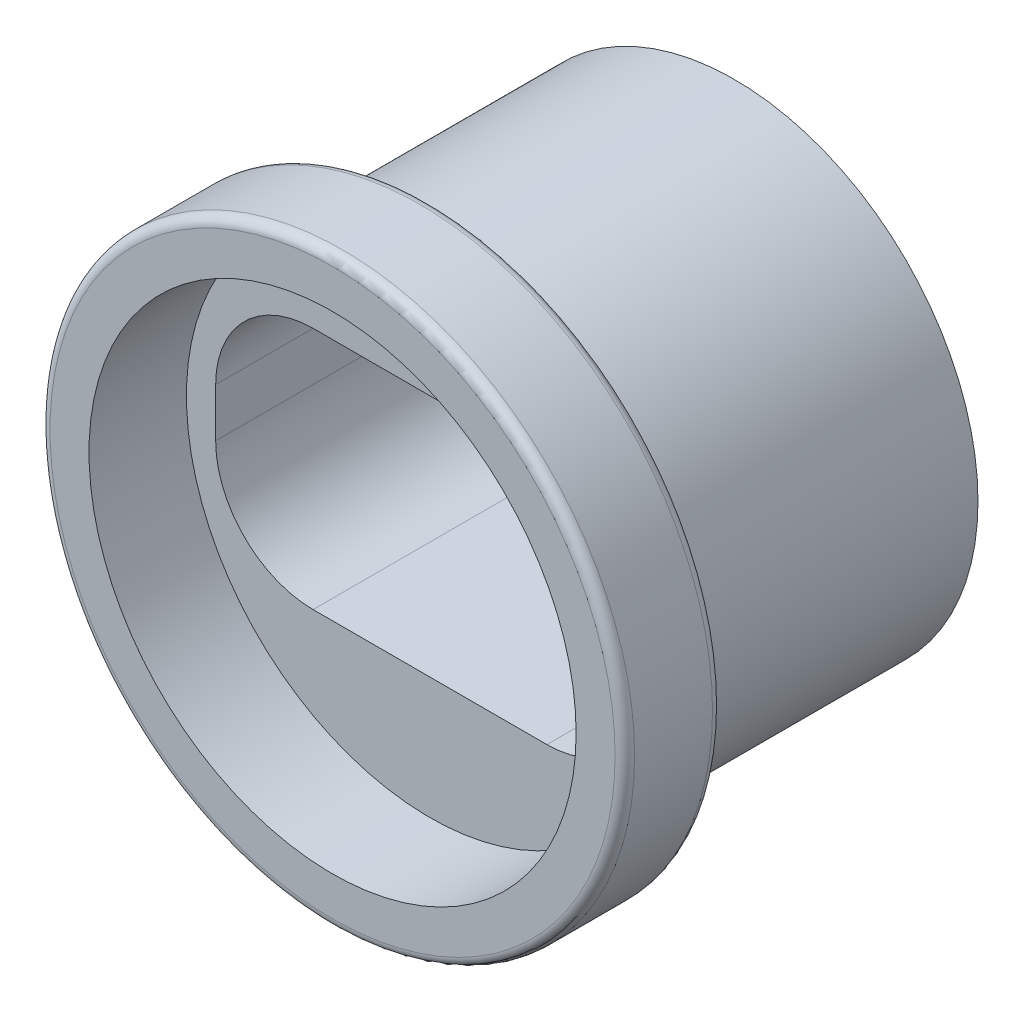
ISO-10303-21;
HEADER;
FILE_DESCRIPTION(('STEP AP214'),'2;1');
FILE_NAME('part.step','',(''),(''),'','','');
FILE_SCHEMA(('AUTOMOTIVE_DESIGN { 1 0 10303 214 1 1 1 1 }'));
ENDSEC;
DATA;
#1=APPLICATION_CONTEXT('core data for automotive mechanical design processes');
#2=APPLICATION_PROTOCOL_DEFINITION('international standard','automotive_design',2000,#1);
#3=PRODUCT_CONTEXT('',#1,'mechanical');
#4=PRODUCT('Part','Part','',(#3));
#5=PRODUCT_RELATED_PRODUCT_CATEGORY('part','',(#4));
#6=PRODUCT_DEFINITION_FORMATION('','',#4);
#7=PRODUCT_DEFINITION_CONTEXT('part definition',#1,'design');
#8=PRODUCT_DEFINITION('design','',#6,#7);
#9=PRODUCT_DEFINITION_SHAPE('','',#8);
#10=(LENGTH_UNIT() NAMED_UNIT(*) SI_UNIT(.MILLI.,.METRE.));
#11=(NAMED_UNIT(*) PLANE_ANGLE_UNIT() SI_UNIT($,.RADIAN.));
#12=(NAMED_UNIT(*) SI_UNIT($,.STERADIAN.) SOLID_ANGLE_UNIT());
#13=UNCERTAINTY_MEASURE_WITH_UNIT(LENGTH_MEASURE(1.E-05),#10,'distance_accuracy_value','');
#14=(GEOMETRIC_REPRESENTATION_CONTEXT(3) GLOBAL_UNCERTAINTY_ASSIGNED_CONTEXT((#13)) GLOBAL_UNIT_ASSIGNED_CONTEXT((#10,
#11,#12)) REPRESENTATION_CONTEXT('',''));
#15=CARTESIAN_POINT('',(0.,0.,0.));
#16=DIRECTION('',(0.,0.,1.));
#17=DIRECTION('',(1.,0.,0.));
#18=AXIS2_PLACEMENT_3D('',#15,#16,#17);
#19=CARTESIAN_POINT('',(0.,0.,10.4775));
#20=DIRECTION('',(0.,0.,1.));
#21=DIRECTION('',(1.,0.,0.));
#22=AXIS2_PLACEMENT_3D('',#19,#20,#21);
#23=PLANE('',#22);
#24=CARTESIAN_POINT('',(0.,0.,10.4775));
#25=DIRECTION('',(0.,0.,1.));
#26=DIRECTION('',(1.,0.,0.));
#27=AXIS2_PLACEMENT_3D('',#24,#25,#26);
#28=CIRCLE('',#27,7.366);
#29=CARTESIAN_POINT('',(7.366,0.,10.4775));
#30=VERTEX_POINT('',#29);
#31=EDGE_CURVE('E62',#30,#30,#28,.T.);
#32=ORIENTED_EDGE('',*,*,#31,.T.);
#33=EDGE_LOOP('',(#32));
#34=FACE_BOUND('',#33,.T.);
#35=CARTESIAN_POINT('',(0.,0.,10.4775));
#36=DIRECTION('',(0.,0.,1.));
#37=DIRECTION('',(1.,0.,0.));
#38=AXIS2_PLACEMENT_3D('',#35,#36,#37);
#39=CIRCLE('',#38,6.35);
#40=CARTESIAN_POINT('',(6.35,0.,10.4775));
#41=VERTEX_POINT('',#40);
#42=EDGE_CURVE('E67',#41,#41,#39,.T.);
#43=ORIENTED_EDGE('',*,*,#42,.F.);
#44=EDGE_LOOP('',(#43));
#45=FACE_BOUND('',#44,.T.);
#46=ADVANCED_FACE('F47',(#34,#45),#23,.T.);
#47=CARTESIAN_POINT('',(0.,0.,7.9375));
#48=DIRECTION('',(0.,0.,1.));
#49=DIRECTION('',(1.,0.,0.));
#50=AXIS2_PLACEMENT_3D('',#47,#48,#49);
#51=PLANE('',#50);
#52=CARTESIAN_POINT('',(0.,0.,7.9375));
#53=DIRECTION('',(0.,0.,1.));
#54=DIRECTION('',(1.,0.,0.));
#55=AXIS2_PLACEMENT_3D('',#52,#53,#54);
#56=CIRCLE('',#55,7.366);
#57=CARTESIAN_POINT('',(7.366,0.,7.9375));
#58=VERTEX_POINT('',#57);
#59=EDGE_CURVE('E11',#58,#58,#56,.F.);
#60=ORIENTED_EDGE('',*,*,#59,.T.);
#61=EDGE_LOOP('',(#60));
#62=FACE_BOUND('',#61,.T.);
#63=CARTESIAN_POINT('',(0.,0.,7.9375));
#64=DIRECTION('',(0.,0.,1.));
#65=DIRECTION('',(1.,0.,0.));
#66=AXIS2_PLACEMENT_3D('',#63,#64,#65);
#67=CIRCLE('',#66,6.35);
#68=CARTESIAN_POINT('',(6.35,0.,7.9375));
#69=VERTEX_POINT('',#68);
#70=EDGE_CURVE('E68',#69,#69,#67,.T.);
#71=ORIENTED_EDGE('',*,*,#70,.T.);
#72=EDGE_LOOP('',(#71));
#73=FACE_BOUND('',#72,.T.);
#74=ADVANCED_FACE('F78',(#62,#73),#51,.F.);
#75=CARTESIAN_POINT('',(0.,0.,10.4775));
#76=DIRECTION('',(0.,0.,-1.));
#77=DIRECTION('',(-1.,0.,0.));
#78=AXIS2_PLACEMENT_3D('',#75,#76,#77);
#79=CYLINDRICAL_SURFACE('',#78,7.62);
#80=CARTESIAN_POINT('',(0.,0.,10.2235));
#81=DIRECTION('',(0.,0.,1.));
#82=DIRECTION('',(1.,0.,0.));
#83=AXIS2_PLACEMENT_3D('',#80,#81,#82);
#84=CIRCLE('',#83,7.62);
#85=CARTESIAN_POINT('',(7.62,0.,10.2235));
#86=VERTEX_POINT('',#85);
#87=EDGE_CURVE('E54',#86,#86,#84,.F.);
#88=ORIENTED_EDGE('',*,*,#87,.T.);
#89=EDGE_LOOP('',(#88));
#90=FACE_BOUND('',#89,.T.);
#91=CARTESIAN_POINT('',(0.,0.,8.1915));
#92=DIRECTION('',(0.,0.,1.));
#93=DIRECTION('',(1.,0.,0.));
#94=AXIS2_PLACEMENT_3D('',#91,#92,#93);
#95=CIRCLE('',#94,7.62);
#96=CARTESIAN_POINT('',(7.62,0.,8.1915));
#97=VERTEX_POINT('',#96);
#98=EDGE_CURVE('E58',#97,#97,#95,.T.);
#99=ORIENTED_EDGE('',*,*,#98,.T.);
#100=EDGE_LOOP('',(#99));
#101=FACE_BOUND('',#100,.T.);
#102=ADVANCED_FACE('F85',(#90,#101),#79,.T.);
#103=CARTESIAN_POINT('',(0.,0.,10.4775));
#104=DIRECTION('',(0.,0.,-1.));
#105=DIRECTION('',(-1.,0.,0.));
#106=AXIS2_PLACEMENT_3D('',#103,#104,#105);
#107=CYLINDRICAL_SURFACE('',#106,6.35);
#108=ORIENTED_EDGE('',*,*,#42,.T.);
#109=EDGE_LOOP('',(#108));
#110=FACE_BOUND('',#109,.T.);
#111=ORIENTED_EDGE('',*,*,#70,.F.);
#112=EDGE_LOOP('',(#111));
#113=FACE_BOUND('',#112,.T.);
#114=ADVANCED_FACE('F74',(#110,#113),#107,.F.);
#115=CARTESIAN_POINT('',(0.,0.,10.2235));
#116=DIRECTION('',(0.,0.,1.));
#117=DIRECTION('',(1.,0.,0.));
#118=AXIS2_PLACEMENT_3D('',#115,#116,#117);
#119=TOROIDAL_SURFACE('',#118,7.366,0.254);
#120=ORIENTED_EDGE('',*,*,#87,.F.);
#121=EDGE_LOOP('',(#120));
#122=FACE_BOUND('',#121,.T.);
#123=ORIENTED_EDGE('',*,*,#31,.F.);
#124=EDGE_LOOP('',(#123));
#125=FACE_BOUND('',#124,.T.);
#126=ADVANCED_FACE('F90',(#122,#125),#119,.T.);
#127=CARTESIAN_POINT('',(0.,0.,8.1915));
#128=DIRECTION('',(0.,0.,1.));
#129=DIRECTION('',(1.,0.,0.));
#130=AXIS2_PLACEMENT_3D('',#127,#128,#129);
#131=TOROIDAL_SURFACE('',#130,7.366,0.254);
#132=ORIENTED_EDGE('',*,*,#59,.F.);
#133=EDGE_LOOP('',(#132));
#134=FACE_BOUND('',#133,.T.);
#135=ORIENTED_EDGE('',*,*,#98,.F.);
#136=EDGE_LOOP('',(#135));
#137=FACE_BOUND('',#136,.T.);
#138=ADVANCED_FACE('F49',(#134,#137),#131,.T.);
#139=CLOSED_SHELL('',(#46,#74,#102,#114,#126,#138));
#140=MANIFOLD_SOLID_BREP('B2',#139);
#141=CARTESIAN_POINT('',(0.,0.,7.9375));
#142=DIRECTION('',(0.,0.,1.));
#143=DIRECTION('',(1.,0.,0.));
#144=AXIS2_PLACEMENT_3D('',#141,#142,#143);
#145=PLANE('',#144);
#146=CARTESIAN_POINT('',(0.,0.,7.9375));
#147=DIRECTION('',(0.,0.,1.));
#148=DIRECTION('',(1.,0.,0.));
#149=AXIS2_PLACEMENT_3D('',#146,#147,#148);
#150=CIRCLE('',#149,6.35);
#151=CARTESIAN_POINT('',(6.35,0.,7.9375));
#152=VERTEX_POINT('',#151);
#153=EDGE_CURVE('E45',#152,#152,#150,.T.);
#154=ORIENTED_EDGE('',*,*,#153,.T.);
#155=EDGE_LOOP('',(#154));
#156=FACE_BOUND('',#155,.T.);
#157=DIRECTION('',(-1.,0.,0.));
#158=VECTOR('',#157,1.);
#159=CARTESIAN_POINT('',(3.04799999999998,3.175,7.9375));
#160=LINE('',#159,#158);
#161=CARTESIAN_POINT('',(3.04799999999998,3.175,7.9375));
#162=VERTEX_POINT('',#161);
#163=CARTESIAN_POINT('',(-3.04799999999998,3.175,7.9375));
#164=VERTEX_POINT('',#163);
#165=EDGE_CURVE('E212',#162,#164,#160,.T.);
#166=ORIENTED_EDGE('',*,*,#165,.F.);
#167=CARTESIAN_POINT('',(3.048,0.635,7.9375));
#168=DIRECTION('',(0.,0.,1.));
#169=DIRECTION('',(1.,0.,0.));
#170=AXIS2_PLACEMENT_3D('',#167,#168,#169);
#171=CIRCLE('',#170,2.54);
#172=CARTESIAN_POINT('',(5.588,0.634999999999981,7.9375));
#173=VERTEX_POINT('',#172);
#174=EDGE_CURVE('E204',#173,#162,#171,.T.);
#175=ORIENTED_EDGE('',*,*,#174,.F.);
#176=DIRECTION('',(0.,1.,0.));
#177=VECTOR('',#176,1.);
#178=CARTESIAN_POINT('',(5.588,-0.634999999999983,7.9375));
#179=LINE('',#178,#177);
#180=CARTESIAN_POINT('',(5.588,-0.634999999999983,7.9375));
#181=VERTEX_POINT('',#180);
#182=EDGE_CURVE('E236',#181,#173,#179,.T.);
#183=ORIENTED_EDGE('',*,*,#182,.F.);
#184=CARTESIAN_POINT('',(3.048,-0.635,7.9375));
#185=DIRECTION('',(0.,0.,1.));
#186=DIRECTION('',(-1.,0.,0.));
#187=AXIS2_PLACEMENT_3D('',#184,#185,#186);
#188=CIRCLE('',#187,2.54);
#189=CARTESIAN_POINT('',(3.04799999999998,-3.175,7.9375));
#190=VERTEX_POINT('',#189);
#191=EDGE_CURVE('E234',#190,#181,#188,.T.);
#192=ORIENTED_EDGE('',*,*,#191,.F.);
#193=DIRECTION('',(1.,0.,0.));
#194=VECTOR('',#193,1.);
#195=CARTESIAN_POINT('',(3.04799999999998,-3.175,7.9375));
#196=LINE('',#195,#194);
#197=CARTESIAN_POINT('',(-3.04799999999998,-3.175,7.9375));
#198=VERTEX_POINT('',#197);
#199=EDGE_CURVE('E232',#198,#190,#196,.T.);
#200=ORIENTED_EDGE('',*,*,#199,.F.);
#201=CARTESIAN_POINT('',(-3.048,-0.635000000000001,7.9375));
#202=DIRECTION('',(0.,0.,1.));
#203=DIRECTION('',(-1.,0.,0.));
#204=AXIS2_PLACEMENT_3D('',#201,#202,#203);
#205=CIRCLE('',#204,2.54);
#206=CARTESIAN_POINT('',(-5.588,-0.635000000000001,7.9375));
#207=VERTEX_POINT('',#206);
#208=EDGE_CURVE('E230',#207,#198,#205,.T.);
#209=ORIENTED_EDGE('',*,*,#208,.F.);
#210=DIRECTION('',(0.,-1.,0.));
#211=VECTOR('',#210,1.);
#212=CARTESIAN_POINT('',(-5.588,-0.634999999999983,7.9375));
#213=LINE('',#212,#211);
#214=CARTESIAN_POINT('',(-5.588,0.634999999999981,7.9375));
#215=VERTEX_POINT('',#214);
#216=EDGE_CURVE('E226',#215,#207,#213,.T.);
#217=ORIENTED_EDGE('',*,*,#216,.F.);
#218=CARTESIAN_POINT('',(-3.048,0.634999999999998,7.9375));
#219=DIRECTION('',(0.,0.,1.));
#220=DIRECTION('',(-1.,0.,0.));
#221=AXIS2_PLACEMENT_3D('',#218,#219,#220);
#222=CIRCLE('',#221,2.54);
#223=EDGE_CURVE('E224',#164,#215,#222,.T.);
#224=ORIENTED_EDGE('',*,*,#223,.F.);
#225=EDGE_LOOP('',(#166,#175,#183,#192,#200,#209,#217,#224));
#226=FACE_BOUND('',#225,.T.);
#227=ADVANCED_FACE('F139',(#156,#226),#145,.T.);
#228=CARTESIAN_POINT('',(0.,0.,0.));
#229=DIRECTION('',(0.,0.,1.));
#230=DIRECTION('',(1.,0.,0.));
#231=AXIS2_PLACEMENT_3D('',#228,#229,#230);
#232=PLANE('',#231);
#233=CARTESIAN_POINT('',(0.,0.,0.));
#234=DIRECTION('',(0.,0.,1.));
#235=DIRECTION('',(1.,0.,0.));
#236=AXIS2_PLACEMENT_3D('',#233,#234,#235);
#237=CIRCLE('',#236,6.35);
#238=CARTESIAN_POINT('',(6.35,0.,0.));
#239=VERTEX_POINT('',#238);
#240=EDGE_CURVE('E143',#239,#239,#237,.T.);
#241=ORIENTED_EDGE('',*,*,#240,.F.);
#242=EDGE_LOOP('',(#241));
#243=FACE_BOUND('',#242,.T.);
#244=CARTESIAN_POINT('',(3.048,0.635,0.));
#245=DIRECTION('',(0.,0.,1.));
#246=DIRECTION('',(1.,0.,0.));
#247=AXIS2_PLACEMENT_3D('',#244,#245,#246);
#248=CIRCLE('',#247,2.54);
#249=CARTESIAN_POINT('',(5.588,0.634999999999981,0.));
#250=VERTEX_POINT('',#249);
#251=CARTESIAN_POINT('',(3.04799999999998,3.175,0.));
#252=VERTEX_POINT('',#251);
#253=EDGE_CURVE('E162',#250,#252,#248,.T.);
#254=ORIENTED_EDGE('',*,*,#253,.T.);
#255=DIRECTION('',(-1.,0.,0.));
#256=VECTOR('',#255,1.);
#257=CARTESIAN_POINT('',(3.04799999999998,3.175,0.));
#258=LINE('',#257,#256);
#259=CARTESIAN_POINT('',(-3.04799999999998,3.175,0.));
#260=VERTEX_POINT('',#259);
#261=EDGE_CURVE('E219',#252,#260,#258,.T.);
#262=ORIENTED_EDGE('',*,*,#261,.T.);
#263=CARTESIAN_POINT('',(-3.048,0.634999999999998,0.));
#264=DIRECTION('',(0.,0.,1.));
#265=DIRECTION('',(-1.,0.,0.));
#266=AXIS2_PLACEMENT_3D('',#263,#264,#265);
#267=CIRCLE('',#266,2.54);
#268=CARTESIAN_POINT('',(-5.588,0.634999999999981,0.));
#269=VERTEX_POINT('',#268);
#270=EDGE_CURVE('E240',#260,#269,#267,.T.);
#271=ORIENTED_EDGE('',*,*,#270,.T.);
#272=DIRECTION('',(0.,-1.,0.));
#273=VECTOR('',#272,1.);
#274=CARTESIAN_POINT('',(-5.588,-0.634999999999983,0.));
#275=LINE('',#274,#273);
#276=CARTESIAN_POINT('',(-5.588,-0.635000000000001,0.));
#277=VERTEX_POINT('',#276);
#278=EDGE_CURVE('E243',#269,#277,#275,.T.);
#279=ORIENTED_EDGE('',*,*,#278,.T.);
#280=CARTESIAN_POINT('',(-3.048,-0.635000000000001,0.));
#281=DIRECTION('',(0.,0.,1.));
#282=DIRECTION('',(-1.,0.,0.));
#283=AXIS2_PLACEMENT_3D('',#280,#281,#282);
#284=CIRCLE('',#283,2.54);
#285=CARTESIAN_POINT('',(-3.04799999999998,-3.175,0.));
#286=VERTEX_POINT('',#285);
#287=EDGE_CURVE('E246',#277,#286,#284,.T.);
#288=ORIENTED_EDGE('',*,*,#287,.T.);
#289=DIRECTION('',(1.,0.,0.));
#290=VECTOR('',#289,1.);
#291=CARTESIAN_POINT('',(3.04799999999998,-3.175,0.));
#292=LINE('',#291,#290);
#293=CARTESIAN_POINT('',(3.04799999999998,-3.175,0.));
#294=VERTEX_POINT('',#293);
#295=EDGE_CURVE('E249',#286,#294,#292,.T.);
#296=ORIENTED_EDGE('',*,*,#295,.T.);
#297=CARTESIAN_POINT('',(3.048,-0.635,0.));
#298=DIRECTION('',(0.,0.,1.));
#299=DIRECTION('',(-1.,0.,0.));
#300=AXIS2_PLACEMENT_3D('',#297,#298,#299);
#301=CIRCLE('',#300,2.54);
#302=CARTESIAN_POINT('',(5.588,-0.634999999999983,0.));
#303=VERTEX_POINT('',#302);
#304=EDGE_CURVE('E252',#294,#303,#301,.T.);
#305=ORIENTED_EDGE('',*,*,#304,.T.);
#306=DIRECTION('',(0.,1.,0.));
#307=VECTOR('',#306,1.);
#308=CARTESIAN_POINT('',(5.588,-0.634999999999983,0.));
#309=LINE('',#308,#307);
#310=EDGE_CURVE('E213',#303,#250,#309,.T.);
#311=ORIENTED_EDGE('',*,*,#310,.T.);
#312=EDGE_LOOP('',(#254,#262,#271,#279,#288,#296,#305,#311));
#313=FACE_BOUND('',#312,.T.);
#314=ADVANCED_FACE('F273',(#243,#313),#232,.F.);
#315=CARTESIAN_POINT('',(0.,0.,7.9375));
#316=DIRECTION('',(0.,0.,-1.));
#317=DIRECTION('',(-1.,0.,0.));
#318=AXIS2_PLACEMENT_3D('',#315,#316,#317);
#319=CYLINDRICAL_SURFACE('',#318,6.35);
#320=ORIENTED_EDGE('',*,*,#153,.F.);
#321=EDGE_LOOP('',(#320));
#322=FACE_BOUND('',#321,.T.);
#323=ORIENTED_EDGE('',*,*,#240,.T.);
#324=EDGE_LOOP('',(#323));
#325=FACE_BOUND('',#324,.T.);
#326=ADVANCED_FACE('F141',(#322,#325),#319,.T.);
#327=CARTESIAN_POINT('',(3.048,0.635,7.9375));
#328=DIRECTION('',(0.,0.,-1.));
#329=DIRECTION('',(-1.,0.,0.));
#330=AXIS2_PLACEMENT_3D('',#327,#328,#329);
#331=CYLINDRICAL_SURFACE('',#330,2.54);
#332=ORIENTED_EDGE('',*,*,#253,.F.);
#333=DIRECTION('',(0.,0.,-1.));
#334=VECTOR('',#333,1.);
#335=CARTESIAN_POINT('',(5.588,0.634999999999981,7.9375));
#336=LINE('',#335,#334);
#337=EDGE_CURVE('E208',#173,#250,#336,.T.);
#338=ORIENTED_EDGE('',*,*,#337,.F.);
#339=ORIENTED_EDGE('',*,*,#174,.T.);
#340=DIRECTION('',(0.,0.,-1.));
#341=VECTOR('',#340,1.);
#342=CARTESIAN_POINT('',(3.04799999999998,3.175,7.9375));
#343=LINE('',#342,#341);
#344=EDGE_CURVE('E207',#162,#252,#343,.T.);
#345=ORIENTED_EDGE('',*,*,#344,.T.);
#346=EDGE_LOOP('',(#332,#338,#339,#345));
#347=FACE_BOUND('',#346,.T.);
#348=ADVANCED_FACE('F206',(#347),#331,.F.);
#349=CARTESIAN_POINT('',(3.04799999999998,3.175,7.9375));
#350=DIRECTION('',(0.,-1.,0.));
#351=DIRECTION('',(1.,0.,0.));
#352=AXIS2_PLACEMENT_3D('',#349,#350,#351);
#353=PLANE('',#352);
#354=ORIENTED_EDGE('',*,*,#261,.F.);
#355=ORIENTED_EDGE('',*,*,#344,.F.);
#356=ORIENTED_EDGE('',*,*,#165,.T.);
#357=DIRECTION('',(0.,0.,-1.));
#358=VECTOR('',#357,1.);
#359=CARTESIAN_POINT('',(-3.04799999999998,3.175,7.9375));
#360=LINE('',#359,#358);
#361=EDGE_CURVE('E220',#164,#260,#360,.T.);
#362=ORIENTED_EDGE('',*,*,#361,.T.);
#363=EDGE_LOOP('',(#354,#355,#356,#362));
#364=FACE_BOUND('',#363,.T.);
#365=ADVANCED_FACE('F216',(#364),#353,.T.);
#366=CARTESIAN_POINT('',(-3.048,0.634999999999998,7.9375));
#367=DIRECTION('',(0.,0.,-1.));
#368=DIRECTION('',(-1.,0.,0.));
#369=AXIS2_PLACEMENT_3D('',#366,#367,#368);
#370=CYLINDRICAL_SURFACE('',#369,2.54);
#371=ORIENTED_EDGE('',*,*,#270,.F.);
#372=ORIENTED_EDGE('',*,*,#361,.F.);
#373=ORIENTED_EDGE('',*,*,#223,.T.);
#374=DIRECTION('',(0.,0.,-1.));
#375=VECTOR('',#374,1.);
#376=CARTESIAN_POINT('',(-5.588,0.634999999999981,7.9375));
#377=LINE('',#376,#375);
#378=EDGE_CURVE('E265',#215,#269,#377,.T.);
#379=ORIENTED_EDGE('',*,*,#378,.T.);
#380=EDGE_LOOP('',(#371,#372,#373,#379));
#381=FACE_BOUND('',#380,.T.);
#382=ADVANCED_FACE('F269',(#381),#370,.F.);
#383=CARTESIAN_POINT('',(-5.588,-0.634999999999983,7.9375));
#384=DIRECTION('',(1.,0.,0.));
#385=DIRECTION('',(0.,0.,-1.));
#386=AXIS2_PLACEMENT_3D('',#383,#384,#385);
#387=PLANE('',#386);
#388=ORIENTED_EDGE('',*,*,#278,.F.);
#389=ORIENTED_EDGE('',*,*,#378,.F.);
#390=ORIENTED_EDGE('',*,*,#216,.T.);
#391=DIRECTION('',(0.,0.,-1.));
#392=VECTOR('',#391,1.);
#393=CARTESIAN_POINT('',(-5.588,-0.635000000000001,7.9375));
#394=LINE('',#393,#392);
#395=EDGE_CURVE('E263',#207,#277,#394,.T.);
#396=ORIENTED_EDGE('',*,*,#395,.T.);
#397=EDGE_LOOP('',(#388,#389,#390,#396));
#398=FACE_BOUND('',#397,.T.);
#399=ADVANCED_FACE('F291',(#398),#387,.T.);
#400=CARTESIAN_POINT('',(-3.048,-0.635000000000001,7.9375));
#401=DIRECTION('',(0.,0.,-1.));
#402=DIRECTION('',(-1.,0.,0.));
#403=AXIS2_PLACEMENT_3D('',#400,#401,#402);
#404=CYLINDRICAL_SURFACE('',#403,2.54);
#405=ORIENTED_EDGE('',*,*,#287,.F.);
#406=ORIENTED_EDGE('',*,*,#395,.F.);
#407=ORIENTED_EDGE('',*,*,#208,.T.);
#408=DIRECTION('',(0.,0.,-1.));
#409=VECTOR('',#408,1.);
#410=CARTESIAN_POINT('',(-3.04799999999998,-3.175,7.9375));
#411=LINE('',#410,#409);
#412=EDGE_CURVE('E261',#198,#286,#411,.T.);
#413=ORIENTED_EDGE('',*,*,#412,.T.);
#414=EDGE_LOOP('',(#405,#406,#407,#413));
#415=FACE_BOUND('',#414,.T.);
#416=ADVANCED_FACE('F288',(#415),#404,.F.);
#417=CARTESIAN_POINT('',(3.04799999999998,-3.175,7.9375));
#418=DIRECTION('',(0.,1.,0.));
#419=DIRECTION('',(-1.,0.,0.));
#420=AXIS2_PLACEMENT_3D('',#417,#418,#419);
#421=PLANE('',#420);
#422=ORIENTED_EDGE('',*,*,#295,.F.);
#423=ORIENTED_EDGE('',*,*,#412,.F.);
#424=ORIENTED_EDGE('',*,*,#199,.T.);
#425=DIRECTION('',(0.,0.,-1.));
#426=VECTOR('',#425,1.);
#427=CARTESIAN_POINT('',(3.04799999999998,-3.175,7.9375));
#428=LINE('',#427,#426);
#429=EDGE_CURVE('E259',#190,#294,#428,.T.);
#430=ORIENTED_EDGE('',*,*,#429,.T.);
#431=EDGE_LOOP('',(#422,#423,#424,#430));
#432=FACE_BOUND('',#431,.T.);
#433=ADVANCED_FACE('F284',(#432),#421,.T.);
#434=CARTESIAN_POINT('',(3.048,-0.635,7.9375));
#435=DIRECTION('',(0.,0.,-1.));
#436=DIRECTION('',(-1.,0.,0.));
#437=AXIS2_PLACEMENT_3D('',#434,#435,#436);
#438=CYLINDRICAL_SURFACE('',#437,2.54);
#439=ORIENTED_EDGE('',*,*,#304,.F.);
#440=ORIENTED_EDGE('',*,*,#429,.F.);
#441=ORIENTED_EDGE('',*,*,#191,.T.);
#442=DIRECTION('',(0.,0.,-1.));
#443=VECTOR('',#442,1.);
#444=CARTESIAN_POINT('',(5.588,-0.634999999999983,7.9375));
#445=LINE('',#444,#443);
#446=EDGE_CURVE('E154',#181,#303,#445,.T.);
#447=ORIENTED_EDGE('',*,*,#446,.T.);
#448=EDGE_LOOP('',(#439,#440,#441,#447));
#449=FACE_BOUND('',#448,.T.);
#450=ADVANCED_FACE('F281',(#449),#438,.F.);
#451=CARTESIAN_POINT('',(5.588,-0.634999999999983,7.9375));
#452=DIRECTION('',(-1.,0.,0.));
#453=DIRECTION('',(0.,0.,1.));
#454=AXIS2_PLACEMENT_3D('',#451,#452,#453);
#455=PLANE('',#454);
#456=ORIENTED_EDGE('',*,*,#310,.F.);
#457=ORIENTED_EDGE('',*,*,#446,.F.);
#458=ORIENTED_EDGE('',*,*,#182,.T.);
#459=ORIENTED_EDGE('',*,*,#337,.T.);
#460=EDGE_LOOP('',(#456,#457,#458,#459));
#461=FACE_BOUND('',#460,.T.);
#462=ADVANCED_FACE('F275',(#461),#455,.T.);
#463=CLOSED_SHELL('',(#227,#314,#326,#348,#365,#382,#399,#416,#433,#450,#462));
#464=MANIFOLD_SOLID_BREP('B6',#463);
#465=ADVANCED_BREP_SHAPE_REPRESENTATION('',(#18,#140,#464),#14);
#466=SHAPE_DEFINITION_REPRESENTATION(#9,#465);
ENDSEC;
END-ISO-10303-21;
